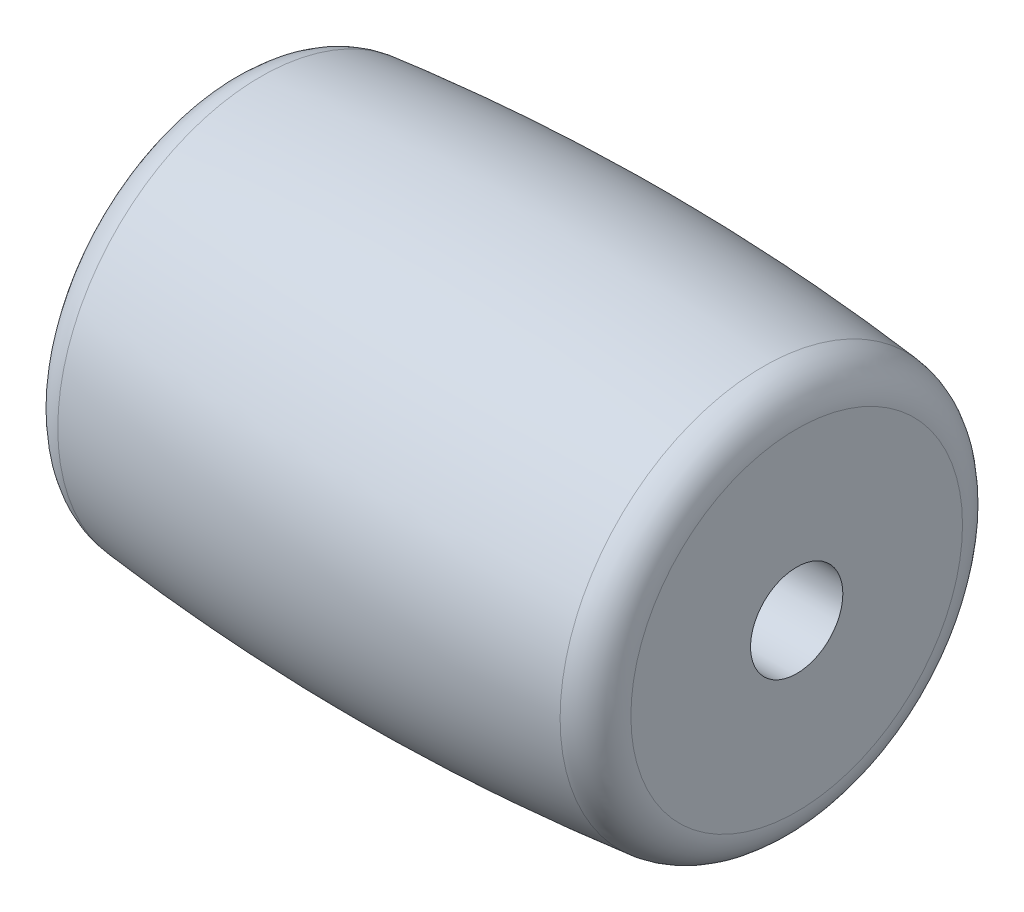
ISO-10303-21;
HEADER;
FILE_DESCRIPTION(('STEP AP214'),'2;1');
FILE_NAME('part.step','',(''),(''),'','','');
FILE_SCHEMA(('AUTOMOTIVE_DESIGN { 1 0 10303 214 1 1 1 1 }'));
ENDSEC;
DATA;
#1=APPLICATION_CONTEXT('core data for automotive mechanical design processes');
#2=APPLICATION_PROTOCOL_DEFINITION('international standard','automotive_design',2000,#1);
#3=PRODUCT_CONTEXT('',#1,'mechanical');
#4=PRODUCT('Part','Part','',(#3));
#5=PRODUCT_RELATED_PRODUCT_CATEGORY('part','',(#4));
#6=PRODUCT_DEFINITION_FORMATION('','',#4);
#7=PRODUCT_DEFINITION_CONTEXT('part definition',#1,'design');
#8=PRODUCT_DEFINITION('design','',#6,#7);
#9=PRODUCT_DEFINITION_SHAPE('','',#8);
#10=(LENGTH_UNIT() NAMED_UNIT(*) SI_UNIT(.MILLI.,.METRE.));
#11=(NAMED_UNIT(*) PLANE_ANGLE_UNIT() SI_UNIT($,.RADIAN.));
#12=(NAMED_UNIT(*) SI_UNIT($,.STERADIAN.) SOLID_ANGLE_UNIT());
#13=UNCERTAINTY_MEASURE_WITH_UNIT(LENGTH_MEASURE(1.E-05),#10,'distance_accuracy_value','');
#14=(GEOMETRIC_REPRESENTATION_CONTEXT(3) GLOBAL_UNCERTAINTY_ASSIGNED_CONTEXT((#13)) GLOBAL_UNIT_ASSIGNED_CONTEXT((#10,
#11,#12)) REPRESENTATION_CONTEXT('',''));
#15=CARTESIAN_POINT('',(0.,0.,0.));
#16=DIRECTION('',(0.,0.,1.));
#17=DIRECTION('',(1.,0.,0.));
#18=AXIS2_PLACEMENT_3D('',#15,#16,#17);
#19=CARTESIAN_POINT('',(-12.065,0.,0.));
#20=DIRECTION('',(1.,0.,0.));
#21=DIRECTION('',(0.,0.,-1.));
#22=AXIS2_PLACEMENT_3D('',#19,#20,#21);
#23=CYLINDRICAL_SURFACE('',#22,1.9558);
#24=CARTESIAN_POINT('',(-12.065,0.,0.));
#25=DIRECTION('',(1.,0.,0.));
#26=DIRECTION('',(0.,0.,-1.));
#27=AXIS2_PLACEMENT_3D('',#24,#25,#26);
#28=CIRCLE('',#27,1.9558);
#29=CARTESIAN_POINT('',(-12.065,0.,-1.9558));
#30=VERTEX_POINT('',#29);
#31=EDGE_CURVE('E52',#30,#30,#28,.F.);
#32=ORIENTED_EDGE('',*,*,#31,.T.);
#33=EDGE_LOOP('',(#32));
#34=FACE_BOUND('',#33,.T.);
#35=CARTESIAN_POINT('',(12.065,0.,0.));
#36=DIRECTION('',(1.,0.,0.));
#37=DIRECTION('',(0.,0.,-1.));
#38=AXIS2_PLACEMENT_3D('',#35,#36,#37);
#39=CIRCLE('',#38,1.9558);
#40=CARTESIAN_POINT('',(12.065,0.,-1.9558));
#41=VERTEX_POINT('',#40);
#42=EDGE_CURVE('E191',#41,#41,#39,.T.);
#43=ORIENTED_EDGE('',*,*,#42,.T.);
#44=EDGE_LOOP('',(#43));
#45=FACE_BOUND('',#44,.T.);
#46=ADVANCED_FACE('F16',(#34,#45),#23,.F.);
#47=CARTESIAN_POINT('',(12.065,8.4455,0.));
#48=DIRECTION('',(-1.,0.,0.));
#49=DIRECTION('',(0.,0.,1.));
#50=AXIS2_PLACEMENT_3D('',#47,#48,#49);
#51=PLANE('',#50);
#52=CARTESIAN_POINT('',(12.065,0.,0.));
#53=DIRECTION('',(-1.,0.,0.));
#54=DIRECTION('',(0.,0.,1.));
#55=AXIS2_PLACEMENT_3D('',#52,#53,#54);
#56=CIRCLE('',#55,7.02656720091259);
#57=CARTESIAN_POINT('',(12.065,0.,7.02656720091259));
#58=VERTEX_POINT('',#57);
#59=CARTESIAN_POINT('',(12.065,0.,-7.02656720091259));
#60=VERTEX_POINT('',#59);
#61=EDGE_CURVE('E44',#58,#60,#56,.T.);
#62=ORIENTED_EDGE('',*,*,#61,.F.);
#63=CARTESIAN_POINT('',(12.065,0.,0.));
#64=DIRECTION('',(-1.,0.,0.));
#65=DIRECTION('',(0.,0.,-1.));
#66=AXIS2_PLACEMENT_3D('',#63,#64,#65);
#67=CIRCLE('',#66,7.02656720091259);
#68=EDGE_CURVE('E47',#60,#58,#67,.T.);
#69=ORIENTED_EDGE('',*,*,#68,.F.);
#70=EDGE_LOOP('',(#62,#69));
#71=FACE_BOUND('',#70,.T.);
#72=ORIENTED_EDGE('',*,*,#42,.F.);
#73=EDGE_LOOP('',(#72));
#74=FACE_BOUND('',#73,.T.);
#75=ADVANCED_FACE('F49',(#71,#74),#51,.F.);
#76=CARTESIAN_POINT('',(-12.065,8.4455,0.));
#77=DIRECTION('',(1.,0.,0.));
#78=DIRECTION('',(0.,0.,-1.));
#79=AXIS2_PLACEMENT_3D('',#76,#77,#78);
#80=PLANE('',#79);
#81=CARTESIAN_POINT('',(-12.065,0.,0.));
#82=DIRECTION('',(1.,0.,0.));
#83=DIRECTION('',(0.,0.,-1.));
#84=AXIS2_PLACEMENT_3D('',#81,#82,#83);
#85=CIRCLE('',#84,7.02656720091259);
#86=CARTESIAN_POINT('',(-12.065,0.,-7.02656720091259));
#87=VERTEX_POINT('',#86);
#88=CARTESIAN_POINT('',(-12.065,0.,7.02656720091259));
#89=VERTEX_POINT('',#88);
#90=EDGE_CURVE('E57',#87,#89,#85,.T.);
#91=ORIENTED_EDGE('',*,*,#90,.F.);
#92=CARTESIAN_POINT('',(-12.065,0.,0.));
#93=DIRECTION('',(1.,0.,0.));
#94=DIRECTION('',(0.,0.,1.));
#95=AXIS2_PLACEMENT_3D('',#92,#93,#94);
#96=CIRCLE('',#95,7.02656720091259);
#97=EDGE_CURVE('E35',#89,#87,#96,.T.);
#98=ORIENTED_EDGE('',*,*,#97,.F.);
#99=EDGE_LOOP('',(#91,#98));
#100=FACE_BOUND('',#99,.T.);
#101=ORIENTED_EDGE('',*,*,#31,.F.);
#102=EDGE_LOOP('',(#101));
#103=FACE_BOUND('',#102,.T.);
#104=ADVANCED_FACE('F76',(#100,#103),#80,.F.);
#105=CARTESIAN_POINT('',(10.4775,0.,0.));
#106=DIRECTION('',(-1.,0.,0.));
#107=DIRECTION('',(0.,0.,1.));
#108=AXIS2_PLACEMENT_3D('',#105,#106,#107);
#109=TOROIDAL_SURFACE('',#108,7.02656720091259,1.5875);
#110=CARTESIAN_POINT('',(10.6438095238095,0.,0.));
#111=DIRECTION('',(-1.,0.,0.));
#112=DIRECTION('',(0.,0.,1.));
#113=AXIS2_PLACEMENT_3D('',#110,#111,#112);
#114=CIRCLE('',#113,8.6053317154271);
#115=CARTESIAN_POINT('',(10.6438095238095,0.,8.6053317154271));
#116=VERTEX_POINT('',#115);
#117=EDGE_CURVE('E27',#116,#116,#114,.T.);
#118=ORIENTED_EDGE('',*,*,#117,.F.);
#119=EDGE_LOOP('',(#118));
#120=FACE_BOUND('',#119,.T.);
#121=ORIENTED_EDGE('',*,*,#61,.T.);
#122=ORIENTED_EDGE('',*,*,#68,.T.);
#123=EDGE_LOOP('',(#121,#122));
#124=FACE_BOUND('',#123,.T.);
#125=ADVANCED_FACE('F56',(#120,#124),#109,.T.);
#126=CARTESIAN_POINT('',(-10.4775,0.,0.));
#127=DIRECTION('',(1.,0.,0.));
#128=DIRECTION('',(0.,0.,-1.));
#129=AXIS2_PLACEMENT_3D('',#126,#127,#128);
#130=TOROIDAL_SURFACE('',#129,7.02656720091259,1.5875);
#131=CARTESIAN_POINT('',(-10.6438095238096,0.,0.));
#132=DIRECTION('',(-1.,0.,0.));
#133=DIRECTION('',(0.,0.,1.));
#134=AXIS2_PLACEMENT_3D('',#131,#132,#133);
#135=CIRCLE('',#134,8.6053317154271);
#136=CARTESIAN_POINT('',(-10.6438095238096,0.,8.6053317154271));
#137=VERTEX_POINT('',#136);
#138=EDGE_CURVE('E11',#137,#137,#135,.F.);
#139=ORIENTED_EDGE('',*,*,#138,.F.);
#140=EDGE_LOOP('',(#139));
#141=FACE_BOUND('',#140,.T.);
#142=ORIENTED_EDGE('',*,*,#90,.T.);
#143=ORIENTED_EDGE('',*,*,#97,.T.);
#144=EDGE_LOOP('',(#142,#143));
#145=FACE_BOUND('',#144,.T.);
#146=ADVANCED_FACE('F75',(#141,#145),#130,.T.);
#147=CARTESIAN_POINT('',(0.,0.,-92.4355972135018));
#148=DIRECTION('',(0.,1.,0.));
#149=DIRECTION('',(0.,0.,1.));
#150=AXIS2_PLACEMENT_3D('',#147,#148,#149);
#151=CIRCLE('',#150,101.6);
#152=TRIMMED_CURVE('',#151,(PARAMETER_VALUE(-0.427996356155038)),
(PARAMETER_VALUE(0.427996356155038)),.T.,.PARAMETER.);
#153=CARTESIAN_POINT('',(0.,0.,0.));
#154=DIRECTION('',(-1.,0.,0.));
#155=AXIS1_PLACEMENT('',#153,#154);
#156=SURFACE_OF_REVOLUTION('',#152,#155);
#157=ORIENTED_EDGE('',*,*,#138,.T.);
#158=EDGE_LOOP('',(#157));
#159=FACE_BOUND('',#158,.T.);
#160=ORIENTED_EDGE('',*,*,#117,.T.);
#161=EDGE_LOOP('',(#160));
#162=FACE_BOUND('',#161,.T.);
#163=ADVANCED_FACE('F130',(#159,#162),#156,.F.);
#164=CLOSED_SHELL('',(#46,#75,#104,#125,#146,#163));
#165=MANIFOLD_SOLID_BREP('B1',#164);
#166=ADVANCED_BREP_SHAPE_REPRESENTATION('',(#18,#165),#14);
#167=SHAPE_DEFINITION_REPRESENTATION(#9,#166);
ENDSEC;
END-ISO-10303-21;
